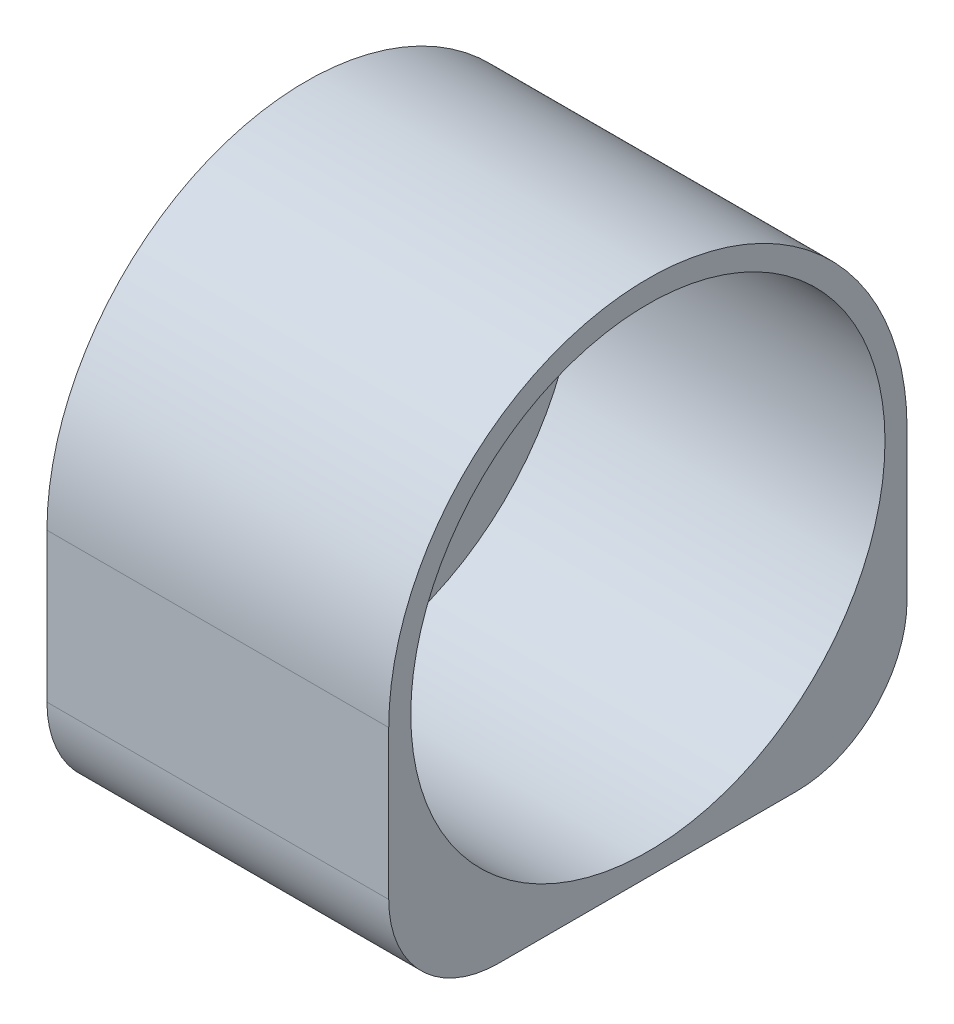
ISO-10303-21;
HEADER;
FILE_DESCRIPTION(('STEP AP214'),'2;1');
FILE_NAME('part.step','',(''),(''),'','','');
FILE_SCHEMA(('AUTOMOTIVE_DESIGN { 1 0 10303 214 1 1 1 1 }'));
ENDSEC;
DATA;
#1=APPLICATION_CONTEXT('core data for automotive mechanical design processes');
#2=APPLICATION_PROTOCOL_DEFINITION('international standard','automotive_design',2000,#1);
#3=PRODUCT_CONTEXT('',#1,'mechanical');
#4=PRODUCT('Part','Part','',(#3));
#5=PRODUCT_RELATED_PRODUCT_CATEGORY('part','',(#4));
#6=PRODUCT_DEFINITION_FORMATION('','',#4);
#7=PRODUCT_DEFINITION_CONTEXT('part definition',#1,'design');
#8=PRODUCT_DEFINITION('design','',#6,#7);
#9=PRODUCT_DEFINITION_SHAPE('','',#8);
#10=(LENGTH_UNIT() NAMED_UNIT(*) SI_UNIT(.MILLI.,.METRE.));
#11=(NAMED_UNIT(*) PLANE_ANGLE_UNIT() SI_UNIT($,.RADIAN.));
#12=(NAMED_UNIT(*) SI_UNIT($,.STERADIAN.) SOLID_ANGLE_UNIT());
#13=UNCERTAINTY_MEASURE_WITH_UNIT(LENGTH_MEASURE(1.E-05),#10,'distance_accuracy_value','');
#14=(GEOMETRIC_REPRESENTATION_CONTEXT(3) GLOBAL_UNCERTAINTY_ASSIGNED_CONTEXT((#13)) GLOBAL_UNIT_ASSIGNED_CONTEXT((#10,
#11,#12)) REPRESENTATION_CONTEXT('',''));
#15=CARTESIAN_POINT('',(0.,0.,0.));
#16=DIRECTION('',(0.,0.,1.));
#17=DIRECTION('',(1.,0.,0.));
#18=AXIS2_PLACEMENT_3D('',#15,#16,#17);
#19=CARTESIAN_POINT('',(28.,0.,0.));
#20=DIRECTION('',(-1.,0.,0.));
#21=DIRECTION('',(0.,0.,1.));
#22=AXIS2_PLACEMENT_3D('',#19,#20,#21);
#23=CYLINDRICAL_SURFACE('',#22,23.5058131676066);
#24=CARTESIAN_POINT('',(28.,0.,0.));
#25=DIRECTION('',(1.,0.,0.));
#26=DIRECTION('',(0.,0.,-1.));
#27=AXIS2_PLACEMENT_3D('',#24,#25,#26);
#28=CIRCLE('',#27,23.5058131676066);
#29=CARTESIAN_POINT('',(28.,0.,-23.5058131676066));
#30=VERTEX_POINT('',#29);
#31=CARTESIAN_POINT('',(28.,0.,23.5058131676066));
#32=VERTEX_POINT('',#31);
#33=EDGE_CURVE('E11',#30,#32,#28,.T.);
#34=ORIENTED_EDGE('',*,*,#33,.F.);
#35=DIRECTION('',(1.,0.,0.));
#36=VECTOR('',#35,1.);
#37=CARTESIAN_POINT('',(-36.2422397762373,0.,-23.5058131676066));
#38=LINE('',#37,#36);
#39=CARTESIAN_POINT('',(-3.,0.,-23.5058131676066));
#40=VERTEX_POINT('',#39);
#41=EDGE_CURVE('E128',#40,#30,#38,.T.);
#42=ORIENTED_EDGE('',*,*,#41,.F.);
#43=CARTESIAN_POINT('',(-3.,0.,0.));
#44=DIRECTION('',(1.,0.,0.));
#45=DIRECTION('',(0.,0.,-1.));
#46=AXIS2_PLACEMENT_3D('',#43,#44,#45);
#47=CIRCLE('',#46,23.5058131676066);
#48=CARTESIAN_POINT('',(-3.,0.,23.5058131676066));
#49=VERTEX_POINT('',#48);
#50=EDGE_CURVE('E68',#40,#49,#47,.T.);
#51=ORIENTED_EDGE('',*,*,#50,.T.);
#52=DIRECTION('',(1.,0.,0.));
#53=VECTOR('',#52,1.);
#54=CARTESIAN_POINT('',(-36.2422397762373,0.,23.5058131676066));
#55=LINE('',#54,#53);
#56=EDGE_CURVE('E258',#49,#32,#55,.T.);
#57=ORIENTED_EDGE('',*,*,#56,.T.);
#58=EDGE_LOOP('',(#34,#42,#51,#57));
#59=FACE_BOUND('',#58,.T.);
#60=ADVANCED_FACE('F47',(#59),#23,.T.);
#61=CARTESIAN_POINT('',(28.,0.,0.));
#62=DIRECTION('',(-1.,0.,0.));
#63=DIRECTION('',(0.,0.,1.));
#64=AXIS2_PLACEMENT_3D('',#61,#62,#63);
#65=CYLINDRICAL_SURFACE('',#64,21.5058131676066);
#66=CARTESIAN_POINT('',(28.,0.,0.));
#67=DIRECTION('',(1.,0.,0.));
#68=DIRECTION('',(0.,0.,-1.));
#69=AXIS2_PLACEMENT_3D('',#66,#67,#68);
#70=CIRCLE('',#69,21.5058131676066);
#71=CARTESIAN_POINT('',(28.,0.,-21.5058131676066));
#72=VERTEX_POINT('',#71);
#73=EDGE_CURVE('E56',#72,#72,#70,.T.);
#74=ORIENTED_EDGE('',*,*,#73,.T.);
#75=EDGE_LOOP('',(#74));
#76=FACE_BOUND('',#75,.T.);
#77=CARTESIAN_POINT('',(0.,0.,0.));
#78=DIRECTION('',(1.,0.,0.));
#79=DIRECTION('',(0.,0.,-1.));
#80=AXIS2_PLACEMENT_3D('',#77,#78,#79);
#81=CIRCLE('',#80,21.5058131676066);
#82=CARTESIAN_POINT('',(0.,0.,-21.5058131676066));
#83=VERTEX_POINT('',#82);
#84=EDGE_CURVE('E51',#83,#83,#81,.T.);
#85=ORIENTED_EDGE('',*,*,#84,.F.);
#86=EDGE_LOOP('',(#85));
#87=FACE_BOUND('',#86,.T.);
#88=ADVANCED_FACE('F49',(#76,#87),#65,.F.);
#89=CARTESIAN_POINT('',(28.,0.,0.));
#90=DIRECTION('',(1.,0.,0.));
#91=DIRECTION('',(0.,0.,-1.));
#92=AXIS2_PLACEMENT_3D('',#89,#90,#91);
#93=PLANE('',#92);
#94=ORIENTED_EDGE('',*,*,#73,.F.);
#95=EDGE_LOOP('',(#94));
#96=FACE_BOUND('',#95,.T.);
#97=DIRECTION('',(0.,0.,-1.));
#98=VECTOR('',#97,1.);
#99=CARTESIAN_POINT('',(28.,-23.5058131676066,0.));
#100=LINE('',#99,#98);
#101=CARTESIAN_POINT('',(28.,-23.5058131676066,13.5058131676065));
#102=VERTEX_POINT('',#101);
#103=CARTESIAN_POINT('',(28.,-23.5058131676066,-13.5058131676065));
#104=VERTEX_POINT('',#103);
#105=EDGE_CURVE('E264',#102,#104,#100,.T.);
#106=ORIENTED_EDGE('',*,*,#105,.T.);
#107=CARTESIAN_POINT('',(28.,-13.5058131676066,-13.5058131676066));
#108=DIRECTION('',(1.,0.,0.));
#109=DIRECTION('',(0.,0.,-1.));
#110=AXIS2_PLACEMENT_3D('',#107,#108,#109);
#111=CIRCLE('',#110,10.);
#112=CARTESIAN_POINT('',(28.,-13.5058131676065,-23.5058131676066));
#113=VERTEX_POINT('',#112);
#114=EDGE_CURVE('E251',#104,#113,#111,.T.);
#115=ORIENTED_EDGE('',*,*,#114,.T.);
#116=DIRECTION('',(0.,1.,0.));
#117=VECTOR('',#116,1.);
#118=CARTESIAN_POINT('',(28.,0.,-23.5058131676066));
#119=LINE('',#118,#117);
#120=EDGE_CURVE('E134',#113,#30,#119,.T.);
#121=ORIENTED_EDGE('',*,*,#120,.T.);
#122=ORIENTED_EDGE('',*,*,#33,.T.);
#123=DIRECTION('',(0.,-1.,0.));
#124=VECTOR('',#123,1.);
#125=CARTESIAN_POINT('',(28.,0.,23.5058131676066));
#126=LINE('',#125,#124);
#127=CARTESIAN_POINT('',(28.,-13.5058131676065,23.5058131676066));
#128=VERTEX_POINT('',#127);
#129=EDGE_CURVE('E249',#32,#128,#126,.T.);
#130=ORIENTED_EDGE('',*,*,#129,.T.);
#131=CARTESIAN_POINT('',(28.,-13.5058131676066,13.5058131676066));
#132=DIRECTION('',(1.,0.,0.));
#133=DIRECTION('',(0.,0.,-1.));
#134=AXIS2_PLACEMENT_3D('',#131,#132,#133);
#135=CIRCLE('',#134,10.);
#136=EDGE_CURVE('E261',#128,#102,#135,.T.);
#137=ORIENTED_EDGE('',*,*,#136,.T.);
#138=EDGE_LOOP('',(#106,#115,#121,#122,#130,#137));
#139=FACE_BOUND('',#138,.T.);
#140=ADVANCED_FACE('F180',(#96,#139),#93,.T.);
#141=CARTESIAN_POINT('',(0.,0.,0.));
#142=DIRECTION('',(1.,0.,0.));
#143=DIRECTION('',(0.,0.,-1.));
#144=AXIS2_PLACEMENT_3D('',#141,#142,#143);
#145=PLANE('',#144);
#146=DIRECTION('',(0.,-1.,0.));
#147=VECTOR('',#146,1.);
#148=CARTESIAN_POINT('',(0.,0.,-6.5));
#149=LINE('',#148,#147);
#150=CARTESIAN_POINT('',(0.,7.5,-6.5));
#151=VERTEX_POINT('',#150);
#152=CARTESIAN_POINT('',(0.,-16.5,-6.5));
#153=VERTEX_POINT('',#152);
#154=EDGE_CURVE('E152',#151,#153,#149,.T.);
#155=ORIENTED_EDGE('',*,*,#154,.T.);
#156=DIRECTION('',(0.,0.,-1.));
#157=VECTOR('',#156,1.);
#158=CARTESIAN_POINT('',(0.,-16.5,0.));
#159=LINE('',#158,#157);
#160=CARTESIAN_POINT('',(0.,-16.5,6.5));
#161=VERTEX_POINT('',#160);
#162=EDGE_CURVE('E155',#161,#153,#159,.T.);
#163=ORIENTED_EDGE('',*,*,#162,.F.);
#164=DIRECTION('',(0.,-1.,0.));
#165=VECTOR('',#164,1.);
#166=CARTESIAN_POINT('',(0.,0.,6.5));
#167=LINE('',#166,#165);
#168=CARTESIAN_POINT('',(0.,7.5,6.5));
#169=VERTEX_POINT('',#168);
#170=EDGE_CURVE('E159',#169,#161,#167,.T.);
#171=ORIENTED_EDGE('',*,*,#170,.F.);
#172=DIRECTION('',(0.,0.,-1.));
#173=VECTOR('',#172,1.);
#174=CARTESIAN_POINT('',(0.,7.5,0.));
#175=LINE('',#174,#173);
#176=EDGE_CURVE('E161',#169,#151,#175,.T.);
#177=ORIENTED_EDGE('',*,*,#176,.T.);
#178=EDGE_LOOP('',(#155,#163,#171,#177));
#179=FACE_BOUND('',#178,.T.);
#180=ORIENTED_EDGE('',*,*,#84,.T.);
#181=EDGE_LOOP('',(#180));
#182=FACE_BOUND('',#181,.T.);
#183=ADVANCED_FACE('F177',(#179,#182),#145,.T.);
#184=CARTESIAN_POINT('',(-3.,0.,-6.5));
#185=DIRECTION('',(0.,0.,1.));
#186=DIRECTION('',(0.,-1.,0.));
#187=AXIS2_PLACEMENT_3D('',#184,#185,#186);
#188=PLANE('',#187);
#189=ORIENTED_EDGE('',*,*,#154,.F.);
#190=DIRECTION('',(1.,0.,0.));
#191=VECTOR('',#190,1.);
#192=CARTESIAN_POINT('',(-3.,7.5,-6.5));
#193=LINE('',#192,#191);
#194=CARTESIAN_POINT('',(-3.,7.5,-6.5));
#195=VERTEX_POINT('',#194);
#196=EDGE_CURVE('E165',#195,#151,#193,.T.);
#197=ORIENTED_EDGE('',*,*,#196,.F.);
#198=DIRECTION('',(0.,-1.,0.));
#199=VECTOR('',#198,1.);
#200=CARTESIAN_POINT('',(-3.,0.,-6.5));
#201=LINE('',#200,#199);
#202=CARTESIAN_POINT('',(-3.,-16.5,-6.5));
#203=VERTEX_POINT('',#202);
#204=EDGE_CURVE('E164',#195,#203,#201,.T.);
#205=ORIENTED_EDGE('',*,*,#204,.T.);
#206=DIRECTION('',(1.,0.,0.));
#207=VECTOR('',#206,1.);
#208=CARTESIAN_POINT('',(-3.,-16.5,-6.5));
#209=LINE('',#208,#207);
#210=EDGE_CURVE('E142',#203,#153,#209,.T.);
#211=ORIENTED_EDGE('',*,*,#210,.T.);
#212=EDGE_LOOP('',(#189,#197,#205,#211));
#213=FACE_BOUND('',#212,.T.);
#214=ADVANCED_FACE('F192',(#213),#188,.T.);
#215=CARTESIAN_POINT('',(-3.,7.5,0.));
#216=DIRECTION('',(0.,-1.,0.));
#217=DIRECTION('',(0.,0.,-1.));
#218=AXIS2_PLACEMENT_3D('',#215,#216,#217);
#219=PLANE('',#218);
#220=ORIENTED_EDGE('',*,*,#176,.F.);
#221=DIRECTION('',(1.,0.,0.));
#222=VECTOR('',#221,1.);
#223=CARTESIAN_POINT('',(-3.,7.5,6.5));
#224=LINE('',#223,#222);
#225=CARTESIAN_POINT('',(-3.,7.5,6.5));
#226=VERTEX_POINT('',#225);
#227=EDGE_CURVE('E167',#226,#169,#224,.T.);
#228=ORIENTED_EDGE('',*,*,#227,.F.);
#229=DIRECTION('',(0.,0.,-1.));
#230=VECTOR('',#229,1.);
#231=CARTESIAN_POINT('',(-3.,7.5,0.));
#232=LINE('',#231,#230);
#233=EDGE_CURVE('E143',#226,#195,#232,.T.);
#234=ORIENTED_EDGE('',*,*,#233,.T.);
#235=ORIENTED_EDGE('',*,*,#196,.T.);
#236=EDGE_LOOP('',(#220,#228,#234,#235));
#237=FACE_BOUND('',#236,.T.);
#238=ADVANCED_FACE('F195',(#237),#219,.T.);
#239=CARTESIAN_POINT('',(-3.,0.,6.5));
#240=DIRECTION('',(0.,0.,1.));
#241=DIRECTION('',(0.,-1.,0.));
#242=AXIS2_PLACEMENT_3D('',#239,#240,#241);
#243=PLANE('',#242);
#244=ORIENTED_EDGE('',*,*,#170,.T.);
#245=DIRECTION('',(1.,0.,0.));
#246=VECTOR('',#245,1.);
#247=CARTESIAN_POINT('',(-3.,-16.5,6.5));
#248=LINE('',#247,#246);
#249=CARTESIAN_POINT('',(-3.,-16.5,6.5));
#250=VERTEX_POINT('',#249);
#251=EDGE_CURVE('E145',#250,#161,#248,.T.);
#252=ORIENTED_EDGE('',*,*,#251,.F.);
#253=DIRECTION('',(0.,-1.,0.));
#254=VECTOR('',#253,1.);
#255=CARTESIAN_POINT('',(-3.,0.,6.5));
#256=LINE('',#255,#254);
#257=EDGE_CURVE('E148',#226,#250,#256,.T.);
#258=ORIENTED_EDGE('',*,*,#257,.F.);
#259=ORIENTED_EDGE('',*,*,#227,.T.);
#260=EDGE_LOOP('',(#244,#252,#258,#259));
#261=FACE_BOUND('',#260,.T.);
#262=ADVANCED_FACE('F199',(#261),#243,.F.);
#263=CARTESIAN_POINT('',(-3.,-16.5,0.));
#264=DIRECTION('',(0.,-1.,0.));
#265=DIRECTION('',(0.,0.,-1.));
#266=AXIS2_PLACEMENT_3D('',#263,#264,#265);
#267=PLANE('',#266);
#268=ORIENTED_EDGE('',*,*,#162,.T.);
#269=ORIENTED_EDGE('',*,*,#210,.F.);
#270=DIRECTION('',(0.,0.,-1.));
#271=VECTOR('',#270,1.);
#272=CARTESIAN_POINT('',(-3.,-16.5,0.));
#273=LINE('',#272,#271);
#274=EDGE_CURVE('E274',#250,#203,#273,.T.);
#275=ORIENTED_EDGE('',*,*,#274,.F.);
#276=ORIENTED_EDGE('',*,*,#251,.T.);
#277=EDGE_LOOP('',(#268,#269,#275,#276));
#278=FACE_BOUND('',#277,.T.);
#279=ADVANCED_FACE('F197',(#278),#267,.F.);
#280=CARTESIAN_POINT('',(-3.,0.,0.));
#281=DIRECTION('',(1.,0.,0.));
#282=DIRECTION('',(0.,0.,-1.));
#283=AXIS2_PLACEMENT_3D('',#280,#281,#282);
#284=PLANE('',#283);
#285=ORIENTED_EDGE('',*,*,#204,.F.);
#286=ORIENTED_EDGE('',*,*,#233,.F.);
#287=ORIENTED_EDGE('',*,*,#257,.T.);
#288=ORIENTED_EDGE('',*,*,#274,.T.);
#289=EDGE_LOOP('',(#285,#286,#287,#288));
#290=FACE_BOUND('',#289,.T.);
#291=ORIENTED_EDGE('',*,*,#50,.F.);
#292=DIRECTION('',(0.,-1.,0.));
#293=VECTOR('',#292,1.);
#294=CARTESIAN_POINT('',(-3.,0.,-23.5058131676066));
#295=LINE('',#294,#293);
#296=CARTESIAN_POINT('',(-3.,-13.5058131676065,-23.5058131676066));
#297=VERTEX_POINT('',#296);
#298=EDGE_CURVE('E125',#40,#297,#295,.T.);
#299=ORIENTED_EDGE('',*,*,#298,.T.);
#300=CARTESIAN_POINT('',(-3.,-13.5058131676066,-13.5058131676066));
#301=DIRECTION('',(1.,0.,0.));
#302=DIRECTION('',(0.,0.,-1.));
#303=AXIS2_PLACEMENT_3D('',#300,#301,#302);
#304=CIRCLE('',#303,10.);
#305=CARTESIAN_POINT('',(-3.,-23.5058131676066,-13.5058131676065));
#306=VERTEX_POINT('',#305);
#307=EDGE_CURVE('E133',#297,#306,#304,.F.);
#308=ORIENTED_EDGE('',*,*,#307,.T.);
#309=DIRECTION('',(0.,0.,1.));
#310=VECTOR('',#309,1.);
#311=CARTESIAN_POINT('',(-3.,-23.5058131676066,0.));
#312=LINE('',#311,#310);
#313=CARTESIAN_POINT('',(-3.,-23.5058131676066,13.5058131676065));
#314=VERTEX_POINT('',#313);
#315=EDGE_CURVE('E256',#306,#314,#312,.T.);
#316=ORIENTED_EDGE('',*,*,#315,.T.);
#317=CARTESIAN_POINT('',(-3.,-13.5058131676066,13.5058131676066));
#318=DIRECTION('',(1.,0.,0.));
#319=DIRECTION('',(0.,0.,-1.));
#320=AXIS2_PLACEMENT_3D('',#317,#318,#319);
#321=CIRCLE('',#320,10.);
#322=CARTESIAN_POINT('',(-3.,-13.5058131676065,23.5058131676066));
#323=VERTEX_POINT('',#322);
#324=EDGE_CURVE('E156',#314,#323,#321,.F.);
#325=ORIENTED_EDGE('',*,*,#324,.T.);
#326=DIRECTION('',(0.,1.,0.));
#327=VECTOR('',#326,1.);
#328=CARTESIAN_POINT('',(-3.,0.,23.5058131676066));
#329=LINE('',#328,#327);
#330=EDGE_CURVE('E140',#323,#49,#329,.T.);
#331=ORIENTED_EDGE('',*,*,#330,.T.);
#332=EDGE_LOOP('',(#291,#299,#308,#316,#325,#331));
#333=FACE_BOUND('',#332,.T.);
#334=ADVANCED_FACE('F138',(#290,#333),#284,.F.);
#335=CARTESIAN_POINT('',(-36.2422397762373,0.,23.5058131676066));
#336=DIRECTION('',(0.,0.,1.));
#337=DIRECTION('',(0.,-1.,0.));
#338=AXIS2_PLACEMENT_3D('',#335,#336,#337);
#339=PLANE('',#338);
#340=ORIENTED_EDGE('',*,*,#330,.F.);
#341=DIRECTION('',(1.,0.,0.));
#342=VECTOR('',#341,1.);
#343=CARTESIAN_POINT('',(-36.2422397762373,-13.5058131676065,23.5058131676066));
#344=LINE('',#343,#342);
#345=EDGE_CURVE('E266',#323,#128,#344,.T.);
#346=ORIENTED_EDGE('',*,*,#345,.T.);
#347=ORIENTED_EDGE('',*,*,#129,.F.);
#348=ORIENTED_EDGE('',*,*,#56,.F.);
#349=EDGE_LOOP('',(#340,#346,#347,#348));
#350=FACE_BOUND('',#349,.T.);
#351=ADVANCED_FACE('F211',(#350),#339,.T.);
#352=CARTESIAN_POINT('',(-36.2422397762373,-23.5058131676066,0.));
#353=DIRECTION('',(0.,-1.,0.));
#354=DIRECTION('',(0.,0.,-1.));
#355=AXIS2_PLACEMENT_3D('',#352,#353,#354);
#356=PLANE('',#355);
#357=CARTESIAN_POINT('',(12.3720812482969,-23.5058131676066,0.));
#358=DIRECTION('',(0.,-1.,0.));
#359=DIRECTION('',(0.,0.,-1.));
#360=AXIS2_PLACEMENT_3D('',#357,#358,#359);
#361=CIRCLE('',#360,10.5);
#362=CARTESIAN_POINT('',(12.3720812482969,-23.5058131676066,-10.5));
#363=VERTEX_POINT('',#362);
#364=EDGE_CURVE('E242',#363,#363,#361,.T.);
#365=ORIENTED_EDGE('',*,*,#364,.F.);
#366=EDGE_LOOP('',(#365));
#367=FACE_BOUND('',#366,.T.);
#368=ORIENTED_EDGE('',*,*,#315,.F.);
#369=DIRECTION('',(1.,0.,0.));
#370=VECTOR('',#369,1.);
#371=CARTESIAN_POINT('',(-36.2422397762373,-23.5058131676066,-13.5058131676065));
#372=LINE('',#371,#370);
#373=EDGE_CURVE('E136',#306,#104,#372,.T.);
#374=ORIENTED_EDGE('',*,*,#373,.T.);
#375=ORIENTED_EDGE('',*,*,#105,.F.);
#376=DIRECTION('',(1.,0.,0.));
#377=VECTOR('',#376,1.);
#378=CARTESIAN_POINT('',(-36.2422397762373,-23.5058131676066,13.5058131676065));
#379=LINE('',#378,#377);
#380=EDGE_CURVE('E268',#314,#102,#379,.T.);
#381=ORIENTED_EDGE('',*,*,#380,.F.);
#382=EDGE_LOOP('',(#368,#374,#375,#381));
#383=FACE_BOUND('',#382,.T.);
#384=ADVANCED_FACE('F215',(#367,#383),#356,.T.);
#385=CARTESIAN_POINT('',(-36.2422397762373,-13.5058131676066,13.5058131676066));
#386=DIRECTION('',(1.,0.,0.));
#387=DIRECTION('',(0.,0.,-1.));
#388=AXIS2_PLACEMENT_3D('',#385,#386,#387);
#389=CYLINDRICAL_SURFACE('',#388,10.);
#390=ORIENTED_EDGE('',*,*,#324,.F.);
#391=ORIENTED_EDGE('',*,*,#380,.T.);
#392=ORIENTED_EDGE('',*,*,#136,.F.);
#393=ORIENTED_EDGE('',*,*,#345,.F.);
#394=EDGE_LOOP('',(#390,#391,#392,#393));
#395=FACE_BOUND('',#394,.T.);
#396=ADVANCED_FACE('F217',(#395),#389,.T.);
#397=CARTESIAN_POINT('',(-36.2422397762373,0.,-23.5058131676066));
#398=DIRECTION('',(0.,0.,-1.));
#399=DIRECTION('',(0.,1.,0.));
#400=AXIS2_PLACEMENT_3D('',#397,#398,#399);
#401=PLANE('',#400);
#402=ORIENTED_EDGE('',*,*,#298,.F.);
#403=ORIENTED_EDGE('',*,*,#41,.T.);
#404=ORIENTED_EDGE('',*,*,#120,.F.);
#405=DIRECTION('',(1.,0.,0.));
#406=VECTOR('',#405,1.);
#407=CARTESIAN_POINT('',(-36.2422397762373,-13.5058131676065,-23.5058131676066));
#408=LINE('',#407,#406);
#409=EDGE_CURVE('E129',#297,#113,#408,.T.);
#410=ORIENTED_EDGE('',*,*,#409,.F.);
#411=EDGE_LOOP('',(#402,#403,#404,#410));
#412=FACE_BOUND('',#411,.T.);
#413=ADVANCED_FACE('F126',(#412),#401,.T.);
#414=CARTESIAN_POINT('',(-36.2422397762373,-13.5058131676066,-13.5058131676066));
#415=DIRECTION('',(1.,0.,0.));
#416=DIRECTION('',(0.,0.,-1.));
#417=AXIS2_PLACEMENT_3D('',#414,#415,#416);
#418=CYLINDRICAL_SURFACE('',#417,10.);
#419=ORIENTED_EDGE('',*,*,#307,.F.);
#420=ORIENTED_EDGE('',*,*,#409,.T.);
#421=ORIENTED_EDGE('',*,*,#114,.F.);
#422=ORIENTED_EDGE('',*,*,#373,.F.);
#423=EDGE_LOOP('',(#419,#420,#421,#422));
#424=FACE_BOUND('',#423,.T.);
#425=ADVANCED_FACE('F226',(#424),#418,.T.);
#426=CARTESIAN_POINT('',(12.3720812482969,-22.5058131676066,0.));
#427=DIRECTION('',(0.,-1.,0.));
#428=DIRECTION('',(0.,0.,-1.));
#429=AXIS2_PLACEMENT_3D('',#426,#427,#428);
#430=CYLINDRICAL_SURFACE('',#429,10.5);
#431=CARTESIAN_POINT('',(12.3720812482969,-22.5058131676066,0.));
#432=DIRECTION('',(0.,-1.,0.));
#433=DIRECTION('',(0.,0.,-1.));
#434=AXIS2_PLACEMENT_3D('',#431,#432,#433);
#435=CIRCLE('',#434,10.5);
#436=CARTESIAN_POINT('',(12.3720812482969,-22.5058131676066,-10.5));
#437=VERTEX_POINT('',#436);
#438=EDGE_CURVE('E241',#437,#437,#435,.T.);
#439=ORIENTED_EDGE('',*,*,#438,.F.);
#440=EDGE_LOOP('',(#439));
#441=FACE_BOUND('',#440,.T.);
#442=ORIENTED_EDGE('',*,*,#364,.T.);
#443=EDGE_LOOP('',(#442));
#444=FACE_BOUND('',#443,.T.);
#445=ADVANCED_FACE('F229',(#441,#444),#430,.F.);
#446=CARTESIAN_POINT('',(0.,-22.5058131676066,0.));
#447=DIRECTION('',(0.,-1.,0.));
#448=DIRECTION('',(0.,0.,-1.));
#449=AXIS2_PLACEMENT_3D('',#446,#447,#448);
#450=PLANE('',#449);
#451=ORIENTED_EDGE('',*,*,#438,.T.);
#452=EDGE_LOOP('',(#451));
#453=FACE_BOUND('',#452,.T.);
#454=ADVANCED_FACE('F233',(#453),#450,.T.);
#455=CLOSED_SHELL('',(#60,#88,#140,#183,#214,#238,#262,#279,#334,#351,#384,#396,#413,#425,#445,#454));
#456=MANIFOLD_SOLID_BREP('B2',#455);
#457=ADVANCED_BREP_SHAPE_REPRESENTATION('',(#18,#456),#14);
#458=SHAPE_DEFINITION_REPRESENTATION(#9,#457);
ENDSEC;
END-ISO-10303-21;
